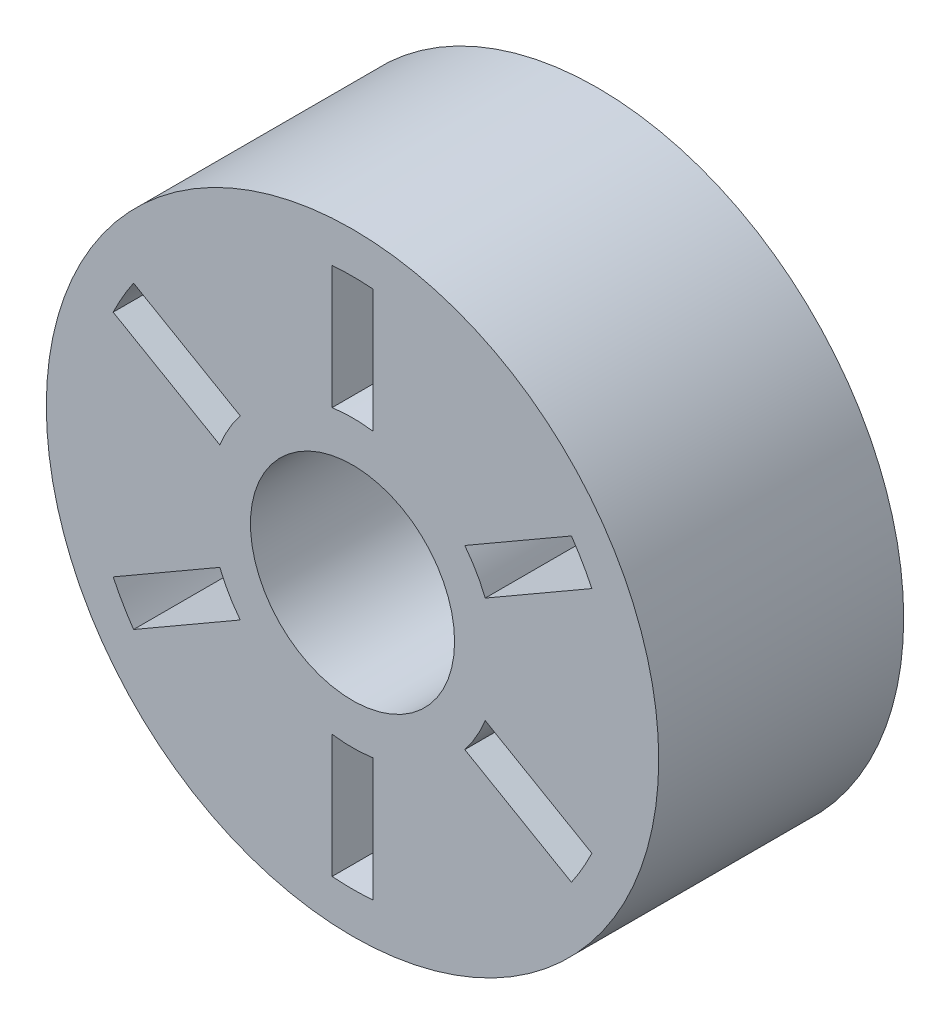
ISO-10303-21;
HEADER;
FILE_DESCRIPTION(('STEP AP214'),'2;1');
FILE_NAME('part.step','',(''),(''),'','','');
FILE_SCHEMA(('AUTOMOTIVE_DESIGN { 1 0 10303 214 1 1 1 1 }'));
ENDSEC;
DATA;
#1=APPLICATION_CONTEXT('core data for automotive mechanical design processes');
#2=APPLICATION_PROTOCOL_DEFINITION('international standard','automotive_design',2000,#1);
#3=PRODUCT_CONTEXT('',#1,'mechanical');
#4=PRODUCT('Part','Part','',(#3));
#5=PRODUCT_RELATED_PRODUCT_CATEGORY('part','',(#4));
#6=PRODUCT_DEFINITION_FORMATION('','',#4);
#7=PRODUCT_DEFINITION_CONTEXT('part definition',#1,'design');
#8=PRODUCT_DEFINITION('design','',#6,#7);
#9=PRODUCT_DEFINITION_SHAPE('','',#8);
#10=(LENGTH_UNIT() NAMED_UNIT(*) SI_UNIT(.MILLI.,.METRE.));
#11=(NAMED_UNIT(*) PLANE_ANGLE_UNIT() SI_UNIT($,.RADIAN.));
#12=(NAMED_UNIT(*) SI_UNIT($,.STERADIAN.) SOLID_ANGLE_UNIT());
#13=UNCERTAINTY_MEASURE_WITH_UNIT(LENGTH_MEASURE(1.E-05),#10,'distance_accuracy_value','');
#14=(GEOMETRIC_REPRESENTATION_CONTEXT(3) GLOBAL_UNCERTAINTY_ASSIGNED_CONTEXT((#13)) GLOBAL_UNIT_ASSIGNED_CONTEXT((#10,
#11,#12)) REPRESENTATION_CONTEXT('',''));
#15=CARTESIAN_POINT('',(0.,0.,0.));
#16=DIRECTION('',(0.,0.,1.));
#17=DIRECTION('',(1.,0.,0.));
#18=AXIS2_PLACEMENT_3D('',#15,#16,#17);
#19=CARTESIAN_POINT('',(0.,0.,30.));
#20=DIRECTION('',(0.,0.,1.));
#21=DIRECTION('',(1.,0.,0.));
#22=AXIS2_PLACEMENT_3D('',#19,#20,#21);
#23=PLANE('',#22);
#24=CARTESIAN_POINT('',(0.,0.,30.));
#25=DIRECTION('',(0.,0.,1.));
#26=DIRECTION('',(0.50000000000001,0.866025403784433,0.));
#27=AXIS2_PLACEMENT_3D('',#24,#25,#26);
#28=CIRCLE('',#27,32.5);
#29=CARTESIAN_POINT('',(-26.8124304008044,18.3669152554811,30.));
#30=VERTEX_POINT('',#29);
#31=CARTESIAN_POINT('',(-29.3124304008044,14.0367882365589,30.));
#32=VERTEX_POINT('',#31);
#33=EDGE_CURVE('E63',#30,#32,#28,.T.);
#34=ORIENTED_EDGE('',*,*,#33,.F.);
#35=DIRECTION('',(-0.866025403784433,0.50000000000001,0.));
#36=VECTOR('',#35,1.);
#37=CARTESIAN_POINT('',(-26.8124304008044,18.3669152554811,30.));
#38=LINE('',#37,#36);
#39=CARTESIAN_POINT('',(-13.7499999999999,10.8253175473056,30.));
#40=VERTEX_POINT('',#39);
#41=EDGE_CURVE('E357',#40,#30,#38,.T.);
#42=ORIENTED_EDGE('',*,*,#41,.F.);
#43=CARTESIAN_POINT('',(0.,0.,30.));
#44=DIRECTION('',(0.,0.,-1.));
#45=DIRECTION('',(0.50000000000001,0.866025403784433,0.));
#46=AXIS2_PLACEMENT_3D('',#43,#44,#45);
#47=CIRCLE('',#46,17.5);
#48=CARTESIAN_POINT('',(-16.2499999999999,6.49519052838348,30.));
#49=VERTEX_POINT('',#48);
#50=EDGE_CURVE('E376',#49,#40,#47,.T.);
#51=ORIENTED_EDGE('',*,*,#50,.F.);
#52=DIRECTION('',(0.866025403784433,-0.50000000000001,0.));
#53=VECTOR('',#52,1.);
#54=CARTESIAN_POINT('',(-29.3124304008044,14.0367882365589,30.));
#55=LINE('',#54,#53);
#56=EDGE_CURVE('E372',#32,#49,#55,.T.);
#57=ORIENTED_EDGE('',*,*,#56,.F.);
#58=EDGE_LOOP('',(#34,#42,#51,#57));
#59=FACE_BOUND('',#58,.T.);
#60=CARTESIAN_POINT('',(0.,0.,30.));
#61=DIRECTION('',(0.,0.,1.));
#62=DIRECTION('',(-0.499999999999992,0.866025403784443,0.));
#63=AXIS2_PLACEMENT_3D('',#60,#61,#62);
#64=CIRCLE('',#63,32.5);
#65=CARTESIAN_POINT('',(-29.3124304008047,-14.0367882365583,30.));
#66=VERTEX_POINT('',#65);
#67=CARTESIAN_POINT('',(-26.8124304008047,-18.3669152554805,30.));
#68=VERTEX_POINT('',#67);
#69=EDGE_CURVE('E71',#66,#68,#64,.T.);
#70=ORIENTED_EDGE('',*,*,#69,.F.);
#71=DIRECTION('',(-0.866025403784443,-0.499999999999992,0.));
#72=VECTOR('',#71,1.);
#73=CARTESIAN_POINT('',(-29.3124304008047,-14.0367882365583,30.));
#74=LINE('',#73,#72);
#75=CARTESIAN_POINT('',(-16.2500000000001,-6.49519052838314,30.));
#76=VERTEX_POINT('',#75);
#77=EDGE_CURVE('E315',#76,#66,#74,.T.);
#78=ORIENTED_EDGE('',*,*,#77,.F.);
#79=CARTESIAN_POINT('',(0.,0.,30.));
#80=DIRECTION('',(0.,0.,-1.));
#81=DIRECTION('',(-0.499999999999992,0.866025403784443,0.));
#82=AXIS2_PLACEMENT_3D('',#79,#80,#81);
#83=CIRCLE('',#82,17.5);
#84=CARTESIAN_POINT('',(-13.7500000000001,-10.8253175473054,30.));
#85=VERTEX_POINT('',#84);
#86=EDGE_CURVE('E335',#85,#76,#83,.T.);
#87=ORIENTED_EDGE('',*,*,#86,.F.);
#88=DIRECTION('',(0.866025403784443,0.499999999999992,0.));
#89=VECTOR('',#88,1.);
#90=CARTESIAN_POINT('',(-26.8124304008047,-18.3669152554805,30.));
#91=LINE('',#90,#89);
#92=EDGE_CURVE('E330',#68,#85,#91,.T.);
#93=ORIENTED_EDGE('',*,*,#92,.F.);
#94=EDGE_LOOP('',(#70,#78,#87,#93));
#95=FACE_BOUND('',#94,.T.);
#96=CARTESIAN_POINT('',(0.,0.,30.));
#97=DIRECTION('',(0.,0.,1.));
#98=DIRECTION('',(-1.,0.,0.));
#99=AXIS2_PLACEMENT_3D('',#96,#97,#98);
#100=CIRCLE('',#99,32.5);
#101=CARTESIAN_POINT('',(-2.5,-32.4037034920393,30.));
#102=VERTEX_POINT('',#101);
#103=CARTESIAN_POINT('',(2.5,-32.4037034920393,30.));
#104=VERTEX_POINT('',#103);
#105=EDGE_CURVE('E284',#102,#104,#100,.T.);
#106=ORIENTED_EDGE('',*,*,#105,.F.);
#107=DIRECTION('',(0.,-1.,0.));
#108=VECTOR('',#107,1.);
#109=CARTESIAN_POINT('',(-2.5,-32.4037034920393,30.));
#110=LINE('',#109,#108);
#111=CARTESIAN_POINT('',(-2.5,-17.3205080756888,30.));
#112=VERTEX_POINT('',#111);
#113=EDGE_CURVE('E271',#112,#102,#110,.T.);
#114=ORIENTED_EDGE('',*,*,#113,.F.);
#115=CARTESIAN_POINT('',(0.,0.,30.));
#116=DIRECTION('',(0.,0.,-1.));
#117=DIRECTION('',(-1.,0.,0.));
#118=AXIS2_PLACEMENT_3D('',#115,#116,#117);
#119=CIRCLE('',#118,17.5);
#120=CARTESIAN_POINT('',(2.5,-17.3205080756888,30.));
#121=VERTEX_POINT('',#120);
#122=EDGE_CURVE('E292',#121,#112,#119,.T.);
#123=ORIENTED_EDGE('',*,*,#122,.F.);
#124=DIRECTION('',(0.,1.,0.));
#125=VECTOR('',#124,1.);
#126=CARTESIAN_POINT('',(2.5,-32.4037034920393,30.));
#127=LINE('',#126,#125);
#128=EDGE_CURVE('E287',#104,#121,#127,.T.);
#129=ORIENTED_EDGE('',*,*,#128,.F.);
#130=EDGE_LOOP('',(#106,#114,#123,#129));
#131=FACE_BOUND('',#130,.T.);
#132=CARTESIAN_POINT('',(0.,0.,30.));
#133=DIRECTION('',(0.,0.,1.));
#134=DIRECTION('',(-0.500000000000004,-0.866025403784436,0.));
#135=AXIS2_PLACEMENT_3D('',#132,#133,#134);
#136=CIRCLE('',#135,32.5);
#137=CARTESIAN_POINT('',(26.8124304008045,-18.3669152554809,30.));
#138=VERTEX_POINT('',#137);
#139=CARTESIAN_POINT('',(29.3124304008045,-14.0367882365587,30.));
#140=VERTEX_POINT('',#139);
#141=EDGE_CURVE('E216',#138,#140,#136,.T.);
#142=ORIENTED_EDGE('',*,*,#141,.F.);
#143=DIRECTION('',(0.866025403784436,-0.500000000000004,0.));
#144=VECTOR('',#143,1.);
#145=CARTESIAN_POINT('',(26.8124304008045,-18.3669152554809,30.));
#146=LINE('',#145,#144);
#147=CARTESIAN_POINT('',(13.75,-10.8253175473056,30.));
#148=VERTEX_POINT('',#147);
#149=EDGE_CURVE('E237',#148,#138,#146,.T.);
#150=ORIENTED_EDGE('',*,*,#149,.F.);
#151=CARTESIAN_POINT('',(0.,0.,30.));
#152=DIRECTION('',(0.,0.,-1.));
#153=DIRECTION('',(-0.500000000000004,-0.866025403784436,0.));
#154=AXIS2_PLACEMENT_3D('',#151,#152,#153);
#155=CIRCLE('',#154,17.5);
#156=CARTESIAN_POINT('',(16.25,-6.49519052838336,30.));
#157=VERTEX_POINT('',#156);
#158=EDGE_CURVE('E241',#157,#148,#155,.T.);
#159=ORIENTED_EDGE('',*,*,#158,.F.);
#160=DIRECTION('',(-0.866025403784436,0.500000000000004,0.));
#161=VECTOR('',#160,1.);
#162=CARTESIAN_POINT('',(29.3124304008045,-14.0367882365587,30.));
#163=LINE('',#162,#161);
#164=EDGE_CURVE('E250',#140,#157,#163,.T.);
#165=ORIENTED_EDGE('',*,*,#164,.F.);
#166=EDGE_LOOP('',(#142,#150,#159,#165));
#167=FACE_BOUND('',#166,.T.);
#168=CARTESIAN_POINT('',(0.,0.,30.));
#169=DIRECTION('',(0.,0.,1.));
#170=DIRECTION('',(0.499999999999998,-0.86602540378444,0.));
#171=AXIS2_PLACEMENT_3D('',#168,#169,#170);
#172=CIRCLE('',#171,32.5);
#173=CARTESIAN_POINT('',(29.3124304008046,14.0367882365585,30.));
#174=VERTEX_POINT('',#173);
#175=CARTESIAN_POINT('',(26.8124304008046,18.3669152554807,30.));
#176=VERTEX_POINT('',#175);
#177=EDGE_CURVE('E260',#174,#176,#172,.T.);
#178=ORIENTED_EDGE('',*,*,#177,.F.);
#179=DIRECTION('',(0.86602540378444,0.499999999999998,0.));
#180=VECTOR('',#179,1.);
#181=CARTESIAN_POINT('',(29.3124304008046,14.0367882365585,30.));
#182=LINE('',#181,#180);
#183=CARTESIAN_POINT('',(16.25,6.49519052838325,30.));
#184=VERTEX_POINT('',#183);
#185=EDGE_CURVE('E398',#184,#174,#182,.T.);
#186=ORIENTED_EDGE('',*,*,#185,.F.);
#187=CARTESIAN_POINT('',(0.,0.,30.));
#188=DIRECTION('',(0.,0.,-1.));
#189=DIRECTION('',(0.499999999999998,-0.86602540378444,0.));
#190=AXIS2_PLACEMENT_3D('',#187,#188,#189);
#191=CIRCLE('',#190,17.5);
#192=CARTESIAN_POINT('',(13.75,10.8253175473055,30.));
#193=VERTEX_POINT('',#192);
#194=EDGE_CURVE('E417',#193,#184,#191,.T.);
#195=ORIENTED_EDGE('',*,*,#194,.F.);
#196=DIRECTION('',(-0.86602540378444,-0.499999999999998,0.));
#197=VECTOR('',#196,1.);
#198=CARTESIAN_POINT('',(26.8124304008046,18.3669152554807,30.));
#199=LINE('',#198,#197);
#200=EDGE_CURVE('E413',#176,#193,#199,.T.);
#201=ORIENTED_EDGE('',*,*,#200,.F.);
#202=EDGE_LOOP('',(#178,#186,#195,#201));
#203=FACE_BOUND('',#202,.T.);
#204=CARTESIAN_POINT('',(0.,0.,30.));
#205=DIRECTION('',(0.,0.,1.));
#206=DIRECTION('',(1.,0.,0.));
#207=AXIS2_PLACEMENT_3D('',#204,#205,#206);
#208=CIRCLE('',#207,32.5);
#209=CARTESIAN_POINT('',(2.5,32.4037034920393,30.));
#210=VERTEX_POINT('',#209);
#211=CARTESIAN_POINT('',(-2.5,32.4037034920393,30.));
#212=VERTEX_POINT('',#211);
#213=EDGE_CURVE('E427',#210,#212,#208,.T.);
#214=ORIENTED_EDGE('',*,*,#213,.F.);
#215=DIRECTION('',(0.,1.,0.));
#216=VECTOR('',#215,1.);
#217=CARTESIAN_POINT('',(2.5,32.4037034920393,30.));
#218=LINE('',#217,#216);
#219=CARTESIAN_POINT('',(2.5,17.3205080756888,30.));
#220=VERTEX_POINT('',#219);
#221=EDGE_CURVE('E442',#220,#210,#218,.T.);
#222=ORIENTED_EDGE('',*,*,#221,.F.);
#223=CARTESIAN_POINT('',(0.,0.,30.));
#224=DIRECTION('',(0.,0.,-1.));
#225=DIRECTION('',(1.,0.,0.));
#226=AXIS2_PLACEMENT_3D('',#223,#224,#225);
#227=CIRCLE('',#226,17.5);
#228=CARTESIAN_POINT('',(-2.5,17.3205080756888,30.));
#229=VERTEX_POINT('',#228);
#230=EDGE_CURVE('E461',#229,#220,#227,.T.);
#231=ORIENTED_EDGE('',*,*,#230,.F.);
#232=DIRECTION('',(0.,-1.,0.));
#233=VECTOR('',#232,1.);
#234=CARTESIAN_POINT('',(-2.5,32.4037034920393,30.));
#235=LINE('',#234,#233);
#236=EDGE_CURVE('E457',#212,#229,#235,.T.);
#237=ORIENTED_EDGE('',*,*,#236,.F.);
#238=EDGE_LOOP('',(#214,#222,#231,#237));
#239=FACE_BOUND('',#238,.T.);
#240=CARTESIAN_POINT('',(0.,0.,30.));
#241=DIRECTION('',(0.,0.,1.));
#242=DIRECTION('',(1.,0.,0.));
#243=AXIS2_PLACEMENT_3D('',#240,#241,#242);
#244=CIRCLE('',#243,37.5);
#245=CARTESIAN_POINT('',(37.5,0.,30.));
#246=VERTEX_POINT('',#245);
#247=EDGE_CURVE('E11',#246,#246,#244,.T.);
#248=ORIENTED_EDGE('',*,*,#247,.T.);
#249=EDGE_LOOP('',(#248));
#250=FACE_BOUND('',#249,.T.);
#251=CARTESIAN_POINT('',(0.,0.,30.));
#252=DIRECTION('',(0.,0.,1.));
#253=DIRECTION('',(1.,0.,0.));
#254=AXIS2_PLACEMENT_3D('',#251,#252,#253);
#255=CIRCLE('',#254,12.5);
#256=CARTESIAN_POINT('',(12.5,0.,30.));
#257=VERTEX_POINT('',#256);
#258=EDGE_CURVE('E481',#257,#257,#255,.T.);
#259=ORIENTED_EDGE('',*,*,#258,.F.);
#260=EDGE_LOOP('',(#259));
#261=FACE_BOUND('',#260,.T.);
#262=ADVANCED_FACE('F47',(#59,#95,#131,#167,#203,#239,#250,#261),#23,.T.);
#263=CARTESIAN_POINT('',(0.,0.,0.));
#264=DIRECTION('',(0.,0.,1.));
#265=DIRECTION('',(1.,0.,0.));
#266=AXIS2_PLACEMENT_3D('',#263,#264,#265);
#267=PLANE('',#266);
#268=DIRECTION('',(-0.866025403784433,0.50000000000001,0.));
#269=VECTOR('',#268,1.);
#270=CARTESIAN_POINT('',(-26.8124304008044,18.3669152554811,0.));
#271=LINE('',#270,#269);
#272=CARTESIAN_POINT('',(-13.7499999999999,10.8253175473056,0.));
#273=VERTEX_POINT('',#272);
#274=CARTESIAN_POINT('',(-26.8124304008044,18.3669152554811,0.));
#275=VERTEX_POINT('',#274);
#276=EDGE_CURVE('E365',#273,#275,#271,.T.);
#277=ORIENTED_EDGE('',*,*,#276,.T.);
#278=CARTESIAN_POINT('',(0.,0.,0.));
#279=DIRECTION('',(0.,0.,1.));
#280=DIRECTION('',(0.50000000000001,0.866025403784433,0.));
#281=AXIS2_PLACEMENT_3D('',#278,#279,#280);
#282=CIRCLE('',#281,32.5);
#283=CARTESIAN_POINT('',(-29.3124304008044,14.0367882365589,0.));
#284=VERTEX_POINT('',#283);
#285=EDGE_CURVE('E352',#275,#284,#282,.T.);
#286=ORIENTED_EDGE('',*,*,#285,.T.);
#287=DIRECTION('',(0.866025403784433,-0.50000000000001,0.));
#288=VECTOR('',#287,1.);
#289=CARTESIAN_POINT('',(-29.3124304008044,14.0367882365589,0.));
#290=LINE('',#289,#288);
#291=CARTESIAN_POINT('',(-16.2499999999999,6.49519052838348,0.));
#292=VERTEX_POINT('',#291);
#293=EDGE_CURVE('E356',#284,#292,#290,.T.);
#294=ORIENTED_EDGE('',*,*,#293,.T.);
#295=CARTESIAN_POINT('',(0.,0.,0.));
#296=DIRECTION('',(0.,0.,-1.));
#297=DIRECTION('',(0.50000000000001,0.866025403784433,0.));
#298=AXIS2_PLACEMENT_3D('',#295,#296,#297);
#299=CIRCLE('',#298,17.5);
#300=EDGE_CURVE('E361',#292,#273,#299,.T.);
#301=ORIENTED_EDGE('',*,*,#300,.T.);
#302=EDGE_LOOP('',(#277,#286,#294,#301));
#303=FACE_BOUND('',#302,.T.);
#304=DIRECTION('',(-0.866025403784443,-0.499999999999992,0.));
#305=VECTOR('',#304,1.);
#306=CARTESIAN_POINT('',(-29.3124304008047,-14.0367882365583,0.));
#307=LINE('',#306,#305);
#308=CARTESIAN_POINT('',(-16.2500000000001,-6.49519052838314,0.));
#309=VERTEX_POINT('',#308);
#310=CARTESIAN_POINT('',(-29.3124304008047,-14.0367882365583,0.));
#311=VERTEX_POINT('',#310);
#312=EDGE_CURVE('E323',#309,#311,#307,.T.);
#313=ORIENTED_EDGE('',*,*,#312,.T.);
#314=CARTESIAN_POINT('',(0.,0.,0.));
#315=DIRECTION('',(0.,0.,1.));
#316=DIRECTION('',(-0.499999999999992,0.866025403784443,0.));
#317=AXIS2_PLACEMENT_3D('',#314,#315,#316);
#318=CIRCLE('',#317,32.5);
#319=CARTESIAN_POINT('',(-26.8124304008047,-18.3669152554805,0.));
#320=VERTEX_POINT('',#319);
#321=EDGE_CURVE('E310',#311,#320,#318,.T.);
#322=ORIENTED_EDGE('',*,*,#321,.T.);
#323=DIRECTION('',(0.866025403784443,0.499999999999992,0.));
#324=VECTOR('',#323,1.);
#325=CARTESIAN_POINT('',(-26.8124304008047,-18.3669152554805,0.));
#326=LINE('',#325,#324);
#327=CARTESIAN_POINT('',(-13.7500000000001,-10.8253175473054,0.));
#328=VERTEX_POINT('',#327);
#329=EDGE_CURVE('E314',#320,#328,#326,.T.);
#330=ORIENTED_EDGE('',*,*,#329,.T.);
#331=CARTESIAN_POINT('',(0.,0.,0.));
#332=DIRECTION('',(0.,0.,-1.));
#333=DIRECTION('',(-0.499999999999992,0.866025403784443,0.));
#334=AXIS2_PLACEMENT_3D('',#331,#332,#333);
#335=CIRCLE('',#334,17.5);
#336=EDGE_CURVE('E319',#328,#309,#335,.T.);
#337=ORIENTED_EDGE('',*,*,#336,.T.);
#338=EDGE_LOOP('',(#313,#322,#330,#337));
#339=FACE_BOUND('',#338,.T.);
#340=DIRECTION('',(0.,-1.,0.));
#341=VECTOR('',#340,1.);
#342=CARTESIAN_POINT('',(-2.5,-32.4037034920393,0.));
#343=LINE('',#342,#341);
#344=CARTESIAN_POINT('',(-2.5,-17.3205080756888,0.));
#345=VERTEX_POINT('',#344);
#346=CARTESIAN_POINT('',(-2.5,-32.4037034920393,0.));
#347=VERTEX_POINT('',#346);
#348=EDGE_CURVE('E279',#345,#347,#343,.T.);
#349=ORIENTED_EDGE('',*,*,#348,.T.);
#350=CARTESIAN_POINT('',(0.,0.,0.));
#351=DIRECTION('',(0.,0.,1.));
#352=DIRECTION('',(-1.,0.,0.));
#353=AXIS2_PLACEMENT_3D('',#350,#351,#352);
#354=CIRCLE('',#353,32.5);
#355=CARTESIAN_POINT('',(2.5,-32.4037034920393,0.));
#356=VERTEX_POINT('',#355);
#357=EDGE_CURVE('E266',#347,#356,#354,.T.);
#358=ORIENTED_EDGE('',*,*,#357,.T.);
#359=DIRECTION('',(0.,1.,0.));
#360=VECTOR('',#359,1.);
#361=CARTESIAN_POINT('',(2.5,-32.4037034920393,0.));
#362=LINE('',#361,#360);
#363=CARTESIAN_POINT('',(2.5,-17.3205080756888,0.));
#364=VERTEX_POINT('',#363);
#365=EDGE_CURVE('E270',#356,#364,#362,.T.);
#366=ORIENTED_EDGE('',*,*,#365,.T.);
#367=CARTESIAN_POINT('',(0.,0.,0.));
#368=DIRECTION('',(0.,0.,-1.));
#369=DIRECTION('',(-1.,0.,0.));
#370=AXIS2_PLACEMENT_3D('',#367,#368,#369);
#371=CIRCLE('',#370,17.5);
#372=EDGE_CURVE('E275',#364,#345,#371,.T.);
#373=ORIENTED_EDGE('',*,*,#372,.T.);
#374=EDGE_LOOP('',(#349,#358,#366,#373));
#375=FACE_BOUND('',#374,.T.);
#376=DIRECTION('',(0.866025403784436,-0.500000000000004,0.));
#377=VECTOR('',#376,1.);
#378=CARTESIAN_POINT('',(26.8124304008045,-18.3669152554809,0.));
#379=LINE('',#378,#377);
#380=CARTESIAN_POINT('',(13.75,-10.8253175473056,0.));
#381=VERTEX_POINT('',#380);
#382=CARTESIAN_POINT('',(26.8124304008045,-18.3669152554809,0.));
#383=VERTEX_POINT('',#382);
#384=EDGE_CURVE('E222',#381,#383,#379,.T.);
#385=ORIENTED_EDGE('',*,*,#384,.T.);
#386=CARTESIAN_POINT('',(0.,0.,0.));
#387=DIRECTION('',(0.,0.,1.));
#388=DIRECTION('',(-0.500000000000004,-0.866025403784436,0.));
#389=AXIS2_PLACEMENT_3D('',#386,#387,#388);
#390=CIRCLE('',#389,32.5);
#391=CARTESIAN_POINT('',(29.3124304008045,-14.0367882365587,0.));
#392=VERTEX_POINT('',#391);
#393=EDGE_CURVE('E213',#383,#392,#390,.T.);
#394=ORIENTED_EDGE('',*,*,#393,.T.);
#395=DIRECTION('',(-0.866025403784436,0.500000000000004,0.));
#396=VECTOR('',#395,1.);
#397=CARTESIAN_POINT('',(29.3124304008045,-14.0367882365587,0.));
#398=LINE('',#397,#396);
#399=CARTESIAN_POINT('',(16.25,-6.49519052838337,0.));
#400=VERTEX_POINT('',#399);
#401=EDGE_CURVE('E226',#392,#400,#398,.T.);
#402=ORIENTED_EDGE('',*,*,#401,.T.);
#403=CARTESIAN_POINT('',(0.,0.,0.));
#404=DIRECTION('',(0.,0.,-1.));
#405=DIRECTION('',(-0.500000000000004,-0.866025403784436,0.));
#406=AXIS2_PLACEMENT_3D('',#403,#404,#405);
#407=CIRCLE('',#406,17.5);
#408=EDGE_CURVE('E231',#400,#381,#407,.T.);
#409=ORIENTED_EDGE('',*,*,#408,.T.);
#410=EDGE_LOOP('',(#385,#394,#402,#409));
#411=FACE_BOUND('',#410,.T.);
#412=DIRECTION('',(0.86602540378444,0.499999999999998,0.));
#413=VECTOR('',#412,1.);
#414=CARTESIAN_POINT('',(29.3124304008046,14.0367882365585,0.));
#415=LINE('',#414,#413);
#416=CARTESIAN_POINT('',(16.25,6.49519052838325,0.));
#417=VERTEX_POINT('',#416);
#418=CARTESIAN_POINT('',(29.3124304008046,14.0367882365585,0.));
#419=VERTEX_POINT('',#418);
#420=EDGE_CURVE('E406',#417,#419,#415,.T.);
#421=ORIENTED_EDGE('',*,*,#420,.T.);
#422=CARTESIAN_POINT('',(0.,0.,0.));
#423=DIRECTION('',(0.,0.,1.));
#424=DIRECTION('',(0.499999999999998,-0.86602540378444,0.));
#425=AXIS2_PLACEMENT_3D('',#422,#423,#424);
#426=CIRCLE('',#425,32.5);
#427=CARTESIAN_POINT('',(26.8124304008046,18.3669152554807,0.));
#428=VERTEX_POINT('',#427);
#429=EDGE_CURVE('E393',#419,#428,#426,.T.);
#430=ORIENTED_EDGE('',*,*,#429,.T.);
#431=DIRECTION('',(-0.86602540378444,-0.499999999999998,0.));
#432=VECTOR('',#431,1.);
#433=CARTESIAN_POINT('',(26.8124304008046,18.3669152554807,0.));
#434=LINE('',#433,#432);
#435=CARTESIAN_POINT('',(13.75,10.8253175473055,0.));
#436=VERTEX_POINT('',#435);
#437=EDGE_CURVE('E397',#428,#436,#434,.T.);
#438=ORIENTED_EDGE('',*,*,#437,.T.);
#439=CARTESIAN_POINT('',(0.,0.,0.));
#440=DIRECTION('',(0.,0.,-1.));
#441=DIRECTION('',(0.499999999999998,-0.86602540378444,0.));
#442=AXIS2_PLACEMENT_3D('',#439,#440,#441);
#443=CIRCLE('',#442,17.5);
#444=EDGE_CURVE('E402',#436,#417,#443,.T.);
#445=ORIENTED_EDGE('',*,*,#444,.T.);
#446=EDGE_LOOP('',(#421,#430,#438,#445));
#447=FACE_BOUND('',#446,.T.);
#448=DIRECTION('',(0.,1.,0.));
#449=VECTOR('',#448,1.);
#450=CARTESIAN_POINT('',(2.5,32.4037034920393,0.));
#451=LINE('',#450,#449);
#452=CARTESIAN_POINT('',(2.5,17.3205080756888,0.));
#453=VERTEX_POINT('',#452);
#454=CARTESIAN_POINT('',(2.5,32.4037034920393,0.));
#455=VERTEX_POINT('',#454);
#456=EDGE_CURVE('E450',#453,#455,#451,.T.);
#457=ORIENTED_EDGE('',*,*,#456,.T.);
#458=CARTESIAN_POINT('',(0.,0.,0.));
#459=DIRECTION('',(0.,0.,1.));
#460=DIRECTION('',(1.,0.,0.));
#461=AXIS2_PLACEMENT_3D('',#458,#459,#460);
#462=CIRCLE('',#461,32.5);
#463=CARTESIAN_POINT('',(-2.5,32.4037034920393,0.));
#464=VERTEX_POINT('',#463);
#465=EDGE_CURVE('E437',#455,#464,#462,.T.);
#466=ORIENTED_EDGE('',*,*,#465,.T.);
#467=DIRECTION('',(0.,-1.,0.));
#468=VECTOR('',#467,1.);
#469=CARTESIAN_POINT('',(-2.5,32.4037034920393,0.));
#470=LINE('',#469,#468);
#471=CARTESIAN_POINT('',(-2.5,17.3205080756888,0.));
#472=VERTEX_POINT('',#471);
#473=EDGE_CURVE('E441',#464,#472,#470,.T.);
#474=ORIENTED_EDGE('',*,*,#473,.T.);
#475=CARTESIAN_POINT('',(0.,0.,0.));
#476=DIRECTION('',(0.,0.,-1.));
#477=DIRECTION('',(1.,0.,0.));
#478=AXIS2_PLACEMENT_3D('',#475,#476,#477);
#479=CIRCLE('',#478,17.5);
#480=EDGE_CURVE('E446',#472,#453,#479,.T.);
#481=ORIENTED_EDGE('',*,*,#480,.T.);
#482=EDGE_LOOP('',(#457,#466,#474,#481));
#483=FACE_BOUND('',#482,.T.);
#484=CARTESIAN_POINT('',(0.,0.,0.));
#485=DIRECTION('',(0.,0.,1.));
#486=DIRECTION('',(1.,0.,0.));
#487=AXIS2_PLACEMENT_3D('',#484,#485,#486);
#488=CIRCLE('',#487,37.5);
#489=CARTESIAN_POINT('',(37.5,0.,0.));
#490=VERTEX_POINT('',#489);
#491=EDGE_CURVE('E51',#490,#490,#488,.T.);
#492=ORIENTED_EDGE('',*,*,#491,.F.);
#493=EDGE_LOOP('',(#492));
#494=FACE_BOUND('',#493,.T.);
#495=CARTESIAN_POINT('',(0.,0.,0.));
#496=DIRECTION('',(0.,0.,1.));
#497=DIRECTION('',(1.,0.,0.));
#498=AXIS2_PLACEMENT_3D('',#495,#496,#497);
#499=CIRCLE('',#498,12.5);
#500=CARTESIAN_POINT('',(12.5,0.,0.));
#501=VERTEX_POINT('',#500);
#502=EDGE_CURVE('E471',#501,#501,#499,.T.);
#503=ORIENTED_EDGE('',*,*,#502,.T.);
#504=EDGE_LOOP('',(#503));
#505=FACE_BOUND('',#504,.T.);
#506=ADVANCED_FACE('F233',(#303,#339,#375,#411,#447,#483,#494,#505),#267,.F.);
#507=CARTESIAN_POINT('',(0.,0.,30.));
#508=DIRECTION('',(0.,0.,-1.));
#509=DIRECTION('',(-1.,0.,0.));
#510=AXIS2_PLACEMENT_3D('',#507,#508,#509);
#511=CYLINDRICAL_SURFACE('',#510,37.5);
#512=ORIENTED_EDGE('',*,*,#247,.F.);
#513=EDGE_LOOP('',(#512));
#514=FACE_BOUND('',#513,.T.);
#515=ORIENTED_EDGE('',*,*,#491,.T.);
#516=EDGE_LOOP('',(#515));
#517=FACE_BOUND('',#516,.T.);
#518=ADVANCED_FACE('F49',(#514,#517),#511,.T.);
#519=CARTESIAN_POINT('',(0.,0.,30.));
#520=DIRECTION('',(0.,0.,-1.));
#521=DIRECTION('',(-1.,0.,0.));
#522=AXIS2_PLACEMENT_3D('',#519,#520,#521);
#523=CYLINDRICAL_SURFACE('',#522,12.5);
#524=ORIENTED_EDGE('',*,*,#258,.T.);
#525=EDGE_LOOP('',(#524));
#526=FACE_BOUND('',#525,.T.);
#527=ORIENTED_EDGE('',*,*,#502,.F.);
#528=EDGE_LOOP('',(#527));
#529=FACE_BOUND('',#528,.T.);
#530=ADVANCED_FACE('F490',(#526,#529),#523,.F.);
#531=CARTESIAN_POINT('',(0.,0.,0.));
#532=DIRECTION('',(0.,0.,1.));
#533=DIRECTION('',(1.,0.,0.));
#534=AXIS2_PLACEMENT_3D('',#531,#532,#533);
#535=CYLINDRICAL_SURFACE('',#534,32.5);
#536=ORIENTED_EDGE('',*,*,#213,.T.);
#537=DIRECTION('',(0.,0.,1.));
#538=VECTOR('',#537,1.);
#539=CARTESIAN_POINT('',(-2.5,32.4037034920393,0.));
#540=LINE('',#539,#538);
#541=EDGE_CURVE('E454',#464,#212,#540,.T.);
#542=ORIENTED_EDGE('',*,*,#541,.F.);
#543=ORIENTED_EDGE('',*,*,#465,.F.);
#544=DIRECTION('',(0.,0.,1.));
#545=VECTOR('',#544,1.);
#546=CARTESIAN_POINT('',(2.5,32.4037034920393,0.));
#547=LINE('',#546,#545);
#548=EDGE_CURVE('E468',#455,#210,#547,.T.);
#549=ORIENTED_EDGE('',*,*,#548,.T.);
#550=EDGE_LOOP('',(#536,#542,#543,#549));
#551=FACE_BOUND('',#550,.T.);
#552=ADVANCED_FACE('F492',(#551),#535,.F.);
#553=CARTESIAN_POINT('',(2.5,32.4037034920393,0.));
#554=DIRECTION('',(1.,0.,0.));
#555=DIRECTION('',(0.,1.,0.));
#556=AXIS2_PLACEMENT_3D('',#553,#554,#555);
#557=PLANE('',#556);
#558=ORIENTED_EDGE('',*,*,#221,.T.);
#559=ORIENTED_EDGE('',*,*,#548,.F.);
#560=ORIENTED_EDGE('',*,*,#456,.F.);
#561=DIRECTION('',(0.,0.,1.));
#562=VECTOR('',#561,1.);
#563=CARTESIAN_POINT('',(2.5,17.3205080756888,0.));
#564=LINE('',#563,#562);
#565=EDGE_CURVE('E472',#453,#220,#564,.T.);
#566=ORIENTED_EDGE('',*,*,#565,.T.);
#567=EDGE_LOOP('',(#558,#559,#560,#566));
#568=FACE_BOUND('',#567,.T.);
#569=ADVANCED_FACE('F499',(#568),#557,.F.);
#570=CARTESIAN_POINT('',(0.,0.,0.));
#571=DIRECTION('',(0.,0.,1.));
#572=DIRECTION('',(1.,0.,0.));
#573=AXIS2_PLACEMENT_3D('',#570,#571,#572);
#574=CYLINDRICAL_SURFACE('',#573,17.5);
#575=ORIENTED_EDGE('',*,*,#230,.T.);
#576=ORIENTED_EDGE('',*,*,#565,.F.);
#577=ORIENTED_EDGE('',*,*,#480,.F.);
#578=DIRECTION('',(0.,0.,1.));
#579=VECTOR('',#578,1.);
#580=CARTESIAN_POINT('',(-2.5,17.3205080756888,0.));
#581=LINE('',#580,#579);
#582=EDGE_CURVE('E475',#472,#229,#581,.T.);
#583=ORIENTED_EDGE('',*,*,#582,.T.);
#584=EDGE_LOOP('',(#575,#576,#577,#583));
#585=FACE_BOUND('',#584,.T.);
#586=ADVANCED_FACE('F549',(#585),#574,.T.);
#587=CARTESIAN_POINT('',(-2.5,32.4037034920393,0.));
#588=DIRECTION('',(-1.,0.,0.));
#589=DIRECTION('',(0.,-1.,0.));
#590=AXIS2_PLACEMENT_3D('',#587,#588,#589);
#591=PLANE('',#590);
#592=ORIENTED_EDGE('',*,*,#236,.T.);
#593=ORIENTED_EDGE('',*,*,#582,.F.);
#594=ORIENTED_EDGE('',*,*,#473,.F.);
#595=ORIENTED_EDGE('',*,*,#541,.T.);
#596=EDGE_LOOP('',(#592,#593,#594,#595));
#597=FACE_BOUND('',#596,.T.);
#598=ADVANCED_FACE('F543',(#597),#591,.F.);
#599=CARTESIAN_POINT('',(0.,0.,0.));
#600=DIRECTION('',(0.,0.,1.));
#601=DIRECTION('',(1.,0.,0.));
#602=AXIS2_PLACEMENT_3D('',#599,#600,#601);
#603=CYLINDRICAL_SURFACE('',#602,32.5);
#604=ORIENTED_EDGE('',*,*,#177,.T.);
#605=DIRECTION('',(0.,0.,1.));
#606=VECTOR('',#605,1.);
#607=CARTESIAN_POINT('',(26.8124304008046,18.3669152554807,0.));
#608=LINE('',#607,#606);
#609=EDGE_CURVE('E410',#428,#176,#608,.T.);
#610=ORIENTED_EDGE('',*,*,#609,.F.);
#611=ORIENTED_EDGE('',*,*,#429,.F.);
#612=DIRECTION('',(0.,0.,1.));
#613=VECTOR('',#612,1.);
#614=CARTESIAN_POINT('',(29.3124304008046,14.0367882365585,0.));
#615=LINE('',#614,#613);
#616=EDGE_CURVE('E424',#419,#174,#615,.T.);
#617=ORIENTED_EDGE('',*,*,#616,.T.);
#618=EDGE_LOOP('',(#604,#610,#611,#617));
#619=FACE_BOUND('',#618,.T.);
#620=ADVANCED_FACE('F555',(#619),#603,.F.);
#621=CARTESIAN_POINT('',(29.3124304008046,14.0367882365585,0.));
#622=DIRECTION('',(0.499999999999998,-0.86602540378444,0.));
#623=DIRECTION('',(0.86602540378444,0.499999999999998,0.));
#624=AXIS2_PLACEMENT_3D('',#621,#622,#623);
#625=PLANE('',#624);
#626=ORIENTED_EDGE('',*,*,#185,.T.);
#627=ORIENTED_EDGE('',*,*,#616,.F.);
#628=ORIENTED_EDGE('',*,*,#420,.F.);
#629=DIRECTION('',(0.,0.,1.));
#630=VECTOR('',#629,1.);
#631=CARTESIAN_POINT('',(16.25,6.49519052838325,0.));
#632=LINE('',#631,#630);
#633=EDGE_CURVE('E428',#417,#184,#632,.T.);
#634=ORIENTED_EDGE('',*,*,#633,.T.);
#635=EDGE_LOOP('',(#626,#627,#628,#634));
#636=FACE_BOUND('',#635,.T.);
#637=ADVANCED_FACE('F561',(#636),#625,.F.);
#638=CARTESIAN_POINT('',(0.,0.,0.));
#639=DIRECTION('',(0.,0.,1.));
#640=DIRECTION('',(1.,0.,0.));
#641=AXIS2_PLACEMENT_3D('',#638,#639,#640);
#642=CYLINDRICAL_SURFACE('',#641,17.5);
#643=ORIENTED_EDGE('',*,*,#194,.T.);
#644=ORIENTED_EDGE('',*,*,#633,.F.);
#645=ORIENTED_EDGE('',*,*,#444,.F.);
#646=DIRECTION('',(0.,0.,1.));
#647=VECTOR('',#646,1.);
#648=CARTESIAN_POINT('',(13.75,10.8253175473055,0.));
#649=LINE('',#648,#647);
#650=EDGE_CURVE('E431',#436,#193,#649,.T.);
#651=ORIENTED_EDGE('',*,*,#650,.T.);
#652=EDGE_LOOP('',(#643,#644,#645,#651));
#653=FACE_BOUND('',#652,.T.);
#654=ADVANCED_FACE('F566',(#653),#642,.T.);
#655=CARTESIAN_POINT('',(26.8124304008046,18.3669152554807,0.));
#656=DIRECTION('',(-0.499999999999998,0.86602540378444,0.));
#657=DIRECTION('',(-0.86602540378444,-0.499999999999998,0.));
#658=AXIS2_PLACEMENT_3D('',#655,#656,#657);
#659=PLANE('',#658);
#660=ORIENTED_EDGE('',*,*,#200,.T.);
#661=ORIENTED_EDGE('',*,*,#650,.F.);
#662=ORIENTED_EDGE('',*,*,#437,.F.);
#663=ORIENTED_EDGE('',*,*,#609,.T.);
#664=EDGE_LOOP('',(#660,#661,#662,#663));
#665=FACE_BOUND('',#664,.T.);
#666=ADVANCED_FACE('F563',(#665),#659,.F.);
#667=CARTESIAN_POINT('',(0.,0.,0.));
#668=DIRECTION('',(0.,0.,1.));
#669=DIRECTION('',(1.,0.,0.));
#670=AXIS2_PLACEMENT_3D('',#667,#668,#669);
#671=CYLINDRICAL_SURFACE('',#670,32.5);
#672=ORIENTED_EDGE('',*,*,#141,.T.);
#673=DIRECTION('',(0.,0.,1.));
#674=VECTOR('',#673,1.);
#675=CARTESIAN_POINT('',(29.3124304008045,-14.0367882365587,0.));
#676=LINE('',#675,#674);
#677=EDGE_CURVE('E209',#392,#140,#676,.T.);
#678=ORIENTED_EDGE('',*,*,#677,.F.);
#679=ORIENTED_EDGE('',*,*,#393,.F.);
#680=DIRECTION('',(0.,0.,1.));
#681=VECTOR('',#680,1.);
#682=CARTESIAN_POINT('',(26.8124304008045,-18.3669152554809,0.));
#683=LINE('',#682,#681);
#684=EDGE_CURVE('E257',#383,#138,#683,.T.);
#685=ORIENTED_EDGE('',*,*,#684,.T.);
#686=EDGE_LOOP('',(#672,#678,#679,#685));
#687=FACE_BOUND('',#686,.T.);
#688=ADVANCED_FACE('F211',(#687),#671,.F.);
#689=CARTESIAN_POINT('',(26.8124304008045,-18.3669152554809,0.));
#690=DIRECTION('',(-0.500000000000004,-0.866025403784436,0.));
#691=DIRECTION('',(0.866025403784436,-0.500000000000004,0.));
#692=AXIS2_PLACEMENT_3D('',#689,#690,#691);
#693=PLANE('',#692);
#694=ORIENTED_EDGE('',*,*,#149,.T.);
#695=ORIENTED_EDGE('',*,*,#684,.F.);
#696=ORIENTED_EDGE('',*,*,#384,.F.);
#697=DIRECTION('',(0.,0.,1.));
#698=VECTOR('',#697,1.);
#699=CARTESIAN_POINT('',(13.75,-10.8253175473056,0.));
#700=LINE('',#699,#698);
#701=EDGE_CURVE('E261',#381,#148,#700,.T.);
#702=ORIENTED_EDGE('',*,*,#701,.T.);
#703=EDGE_LOOP('',(#694,#695,#696,#702));
#704=FACE_BOUND('',#703,.T.);
#705=ADVANCED_FACE('F622',(#704),#693,.F.);
#706=CARTESIAN_POINT('',(0.,0.,0.));
#707=DIRECTION('',(0.,0.,1.));
#708=DIRECTION('',(1.,0.,0.));
#709=AXIS2_PLACEMENT_3D('',#706,#707,#708);
#710=CYLINDRICAL_SURFACE('',#709,17.5);
#711=ORIENTED_EDGE('',*,*,#158,.T.);
#712=ORIENTED_EDGE('',*,*,#701,.F.);
#713=ORIENTED_EDGE('',*,*,#408,.F.);
#714=DIRECTION('',(0.,0.,1.));
#715=VECTOR('',#714,1.);
#716=CARTESIAN_POINT('',(16.25,-6.49519052838336,0.));
#717=LINE('',#716,#715);
#718=EDGE_CURVE('E221',#400,#157,#717,.T.);
#719=ORIENTED_EDGE('',*,*,#718,.T.);
#720=EDGE_LOOP('',(#711,#712,#713,#719));
#721=FACE_BOUND('',#720,.T.);
#722=ADVANCED_FACE('F625',(#721),#710,.T.);
#723=CARTESIAN_POINT('',(29.3124304008045,-14.0367882365587,0.));
#724=DIRECTION('',(0.500000000000004,0.866025403784436,0.));
#725=DIRECTION('',(-0.866025403784436,0.500000000000004,0.));
#726=AXIS2_PLACEMENT_3D('',#723,#724,#725);
#727=PLANE('',#726);
#728=ORIENTED_EDGE('',*,*,#164,.T.);
#729=ORIENTED_EDGE('',*,*,#718,.F.);
#730=ORIENTED_EDGE('',*,*,#401,.F.);
#731=ORIENTED_EDGE('',*,*,#677,.T.);
#732=EDGE_LOOP('',(#728,#729,#730,#731));
#733=FACE_BOUND('',#732,.T.);
#734=ADVANCED_FACE('F227',(#733),#727,.F.);
#735=CARTESIAN_POINT('',(0.,0.,0.));
#736=DIRECTION('',(0.,0.,1.));
#737=DIRECTION('',(1.,0.,0.));
#738=AXIS2_PLACEMENT_3D('',#735,#736,#737);
#739=CYLINDRICAL_SURFACE('',#738,32.5);
#740=ORIENTED_EDGE('',*,*,#105,.T.);
#741=DIRECTION('',(0.,0.,1.));
#742=VECTOR('',#741,1.);
#743=CARTESIAN_POINT('',(2.5,-32.4037034920393,0.));
#744=LINE('',#743,#742);
#745=EDGE_CURVE('E283',#356,#104,#744,.T.);
#746=ORIENTED_EDGE('',*,*,#745,.F.);
#747=ORIENTED_EDGE('',*,*,#357,.F.);
#748=DIRECTION('',(0.,0.,1.));
#749=VECTOR('',#748,1.);
#750=CARTESIAN_POINT('',(-2.5,-32.4037034920393,0.));
#751=LINE('',#750,#749);
#752=EDGE_CURVE('E251',#347,#102,#751,.T.);
#753=ORIENTED_EDGE('',*,*,#752,.T.);
#754=EDGE_LOOP('',(#740,#746,#747,#753));
#755=FACE_BOUND('',#754,.T.);
#756=ADVANCED_FACE('F605',(#755),#739,.F.);
#757=CARTESIAN_POINT('',(-2.5,-32.4037034920393,0.));
#758=DIRECTION('',(-1.,0.,0.));
#759=DIRECTION('',(0.,-1.,0.));
#760=AXIS2_PLACEMENT_3D('',#757,#758,#759);
#761=PLANE('',#760);
#762=ORIENTED_EDGE('',*,*,#113,.T.);
#763=ORIENTED_EDGE('',*,*,#752,.F.);
#764=ORIENTED_EDGE('',*,*,#348,.F.);
#765=DIRECTION('',(0.,0.,1.));
#766=VECTOR('',#765,1.);
#767=CARTESIAN_POINT('',(-2.5,-17.3205080756888,0.));
#768=LINE('',#767,#766);
#769=EDGE_CURVE('E301',#345,#112,#768,.T.);
#770=ORIENTED_EDGE('',*,*,#769,.T.);
#771=EDGE_LOOP('',(#762,#763,#764,#770));
#772=FACE_BOUND('',#771,.T.);
#773=ADVANCED_FACE('F608',(#772),#761,.F.);
#774=CARTESIAN_POINT('',(0.,0.,0.));
#775=DIRECTION('',(0.,0.,1.));
#776=DIRECTION('',(1.,0.,0.));
#777=AXIS2_PLACEMENT_3D('',#774,#775,#776);
#778=CYLINDRICAL_SURFACE('',#777,17.5);
#779=ORIENTED_EDGE('',*,*,#122,.T.);
#780=ORIENTED_EDGE('',*,*,#769,.F.);
#781=ORIENTED_EDGE('',*,*,#372,.F.);
#782=DIRECTION('',(0.,0.,1.));
#783=VECTOR('',#782,1.);
#784=CARTESIAN_POINT('',(2.5,-17.3205080756888,0.));
#785=LINE('',#784,#783);
#786=EDGE_CURVE('E304',#364,#121,#785,.T.);
#787=ORIENTED_EDGE('',*,*,#786,.T.);
#788=EDGE_LOOP('',(#779,#780,#781,#787));
#789=FACE_BOUND('',#788,.T.);
#790=ADVANCED_FACE('F612',(#789),#778,.T.);
#791=CARTESIAN_POINT('',(2.5,-32.4037034920393,0.));
#792=DIRECTION('',(1.,0.,0.));
#793=DIRECTION('',(0.,1.,0.));
#794=AXIS2_PLACEMENT_3D('',#791,#792,#793);
#795=PLANE('',#794);
#796=ORIENTED_EDGE('',*,*,#128,.T.);
#797=ORIENTED_EDGE('',*,*,#786,.F.);
#798=ORIENTED_EDGE('',*,*,#365,.F.);
#799=ORIENTED_EDGE('',*,*,#745,.T.);
#800=EDGE_LOOP('',(#796,#797,#798,#799));
#801=FACE_BOUND('',#800,.T.);
#802=ADVANCED_FACE('F594',(#801),#795,.F.);
#803=CARTESIAN_POINT('',(0.,0.,0.));
#804=DIRECTION('',(0.,0.,1.));
#805=DIRECTION('',(1.,0.,0.));
#806=AXIS2_PLACEMENT_3D('',#803,#804,#805);
#807=CYLINDRICAL_SURFACE('',#806,32.5);
#808=ORIENTED_EDGE('',*,*,#69,.T.);
#809=DIRECTION('',(0.,0.,1.));
#810=VECTOR('',#809,1.);
#811=CARTESIAN_POINT('',(-26.8124304008047,-18.3669152554805,0.));
#812=LINE('',#811,#810);
#813=EDGE_CURVE('E327',#320,#68,#812,.T.);
#814=ORIENTED_EDGE('',*,*,#813,.F.);
#815=ORIENTED_EDGE('',*,*,#321,.F.);
#816=DIRECTION('',(0.,0.,1.));
#817=VECTOR('',#816,1.);
#818=CARTESIAN_POINT('',(-29.3124304008047,-14.0367882365583,0.));
#819=LINE('',#818,#817);
#820=EDGE_CURVE('E288',#311,#66,#819,.T.);
#821=ORIENTED_EDGE('',*,*,#820,.T.);
#822=EDGE_LOOP('',(#808,#814,#815,#821));
#823=FACE_BOUND('',#822,.T.);
#824=ADVANCED_FACE('F590',(#823),#807,.F.);
#825=CARTESIAN_POINT('',(-29.3124304008047,-14.0367882365583,0.));
#826=DIRECTION('',(-0.499999999999992,0.866025403784443,0.));
#827=DIRECTION('',(-0.866025403784443,-0.499999999999992,0.));
#828=AXIS2_PLACEMENT_3D('',#825,#826,#827);
#829=PLANE('',#828);
#830=ORIENTED_EDGE('',*,*,#77,.T.);
#831=ORIENTED_EDGE('',*,*,#820,.F.);
#832=ORIENTED_EDGE('',*,*,#312,.F.);
#833=DIRECTION('',(0.,0.,1.));
#834=VECTOR('',#833,1.);
#835=CARTESIAN_POINT('',(-16.2500000000001,-6.49519052838314,0.));
#836=LINE('',#835,#834);
#837=EDGE_CURVE('E344',#309,#76,#836,.T.);
#838=ORIENTED_EDGE('',*,*,#837,.T.);
#839=EDGE_LOOP('',(#830,#831,#832,#838));
#840=FACE_BOUND('',#839,.T.);
#841=ADVANCED_FACE('F593',(#840),#829,.F.);
#842=CARTESIAN_POINT('',(0.,0.,0.));
#843=DIRECTION('',(0.,0.,1.));
#844=DIRECTION('',(1.,0.,0.));
#845=AXIS2_PLACEMENT_3D('',#842,#843,#844);
#846=CYLINDRICAL_SURFACE('',#845,17.5);
#847=ORIENTED_EDGE('',*,*,#86,.T.);
#848=ORIENTED_EDGE('',*,*,#837,.F.);
#849=ORIENTED_EDGE('',*,*,#336,.F.);
#850=DIRECTION('',(0.,0.,1.));
#851=VECTOR('',#850,1.);
#852=CARTESIAN_POINT('',(-13.7500000000001,-10.8253175473054,0.));
#853=LINE('',#852,#851);
#854=EDGE_CURVE('E347',#328,#85,#853,.T.);
#855=ORIENTED_EDGE('',*,*,#854,.T.);
#856=EDGE_LOOP('',(#847,#848,#849,#855));
#857=FACE_BOUND('',#856,.T.);
#858=ADVANCED_FACE('F597',(#857),#846,.T.);
#859=CARTESIAN_POINT('',(-26.8124304008047,-18.3669152554805,0.));
#860=DIRECTION('',(0.499999999999992,-0.866025403784443,0.));
#861=DIRECTION('',(0.866025403784443,0.499999999999992,0.));
#862=AXIS2_PLACEMENT_3D('',#859,#860,#861);
#863=PLANE('',#862);
#864=ORIENTED_EDGE('',*,*,#92,.T.);
#865=ORIENTED_EDGE('',*,*,#854,.F.);
#866=ORIENTED_EDGE('',*,*,#329,.F.);
#867=ORIENTED_EDGE('',*,*,#813,.T.);
#868=EDGE_LOOP('',(#864,#865,#866,#867));
#869=FACE_BOUND('',#868,.T.);
#870=ADVANCED_FACE('F578',(#869),#863,.F.);
#871=CARTESIAN_POINT('',(0.,0.,0.));
#872=DIRECTION('',(0.,0.,1.));
#873=DIRECTION('',(1.,0.,0.));
#874=AXIS2_PLACEMENT_3D('',#871,#872,#873);
#875=CYLINDRICAL_SURFACE('',#874,32.5);
#876=ORIENTED_EDGE('',*,*,#33,.T.);
#877=DIRECTION('',(0.,0.,1.));
#878=VECTOR('',#877,1.);
#879=CARTESIAN_POINT('',(-29.3124304008044,14.0367882365589,0.));
#880=LINE('',#879,#878);
#881=EDGE_CURVE('E369',#284,#32,#880,.T.);
#882=ORIENTED_EDGE('',*,*,#881,.F.);
#883=ORIENTED_EDGE('',*,*,#285,.F.);
#884=DIRECTION('',(0.,0.,1.));
#885=VECTOR('',#884,1.);
#886=CARTESIAN_POINT('',(-26.8124304008044,18.3669152554811,0.));
#887=LINE('',#886,#885);
#888=EDGE_CURVE('E331',#275,#30,#887,.T.);
#889=ORIENTED_EDGE('',*,*,#888,.T.);
#890=EDGE_LOOP('',(#876,#882,#883,#889));
#891=FACE_BOUND('',#890,.T.);
#892=ADVANCED_FACE('F574',(#891),#875,.F.);
#893=CARTESIAN_POINT('',(-26.8124304008044,18.3669152554811,0.));
#894=DIRECTION('',(0.50000000000001,0.866025403784433,0.));
#895=DIRECTION('',(-0.866025403784433,0.50000000000001,0.));
#896=AXIS2_PLACEMENT_3D('',#893,#894,#895);
#897=PLANE('',#896);
#898=ORIENTED_EDGE('',*,*,#41,.T.);
#899=ORIENTED_EDGE('',*,*,#888,.F.);
#900=ORIENTED_EDGE('',*,*,#276,.F.);
#901=DIRECTION('',(0.,0.,1.));
#902=VECTOR('',#901,1.);
#903=CARTESIAN_POINT('',(-13.7499999999999,10.8253175473056,0.));
#904=LINE('',#903,#902);
#905=EDGE_CURVE('E385',#273,#40,#904,.T.);
#906=ORIENTED_EDGE('',*,*,#905,.T.);
#907=EDGE_LOOP('',(#898,#899,#900,#906));
#908=FACE_BOUND('',#907,.T.);
#909=ADVANCED_FACE('F577',(#908),#897,.F.);
#910=CARTESIAN_POINT('',(0.,0.,0.));
#911=DIRECTION('',(0.,0.,1.));
#912=DIRECTION('',(1.,0.,0.));
#913=AXIS2_PLACEMENT_3D('',#910,#911,#912);
#914=CYLINDRICAL_SURFACE('',#913,17.5);
#915=ORIENTED_EDGE('',*,*,#50,.T.);
#916=ORIENTED_EDGE('',*,*,#905,.F.);
#917=ORIENTED_EDGE('',*,*,#300,.F.);
#918=DIRECTION('',(0.,0.,1.));
#919=VECTOR('',#918,1.);
#920=CARTESIAN_POINT('',(-16.2499999999999,6.49519052838348,0.));
#921=LINE('',#920,#919);
#922=EDGE_CURVE('E388',#292,#49,#921,.T.);
#923=ORIENTED_EDGE('',*,*,#922,.T.);
#924=EDGE_LOOP('',(#915,#916,#917,#923));
#925=FACE_BOUND('',#924,.T.);
#926=ADVANCED_FACE('F582',(#925),#914,.T.);
#927=CARTESIAN_POINT('',(-29.3124304008044,14.0367882365589,0.));
#928=DIRECTION('',(-0.50000000000001,-0.866025403784433,0.));
#929=DIRECTION('',(0.866025403784433,-0.50000000000001,0.));
#930=AXIS2_PLACEMENT_3D('',#927,#928,#929);
#931=PLANE('',#930);
#932=ORIENTED_EDGE('',*,*,#56,.T.);
#933=ORIENTED_EDGE('',*,*,#922,.F.);
#934=ORIENTED_EDGE('',*,*,#293,.F.);
#935=ORIENTED_EDGE('',*,*,#881,.T.);
#936=EDGE_LOOP('',(#932,#933,#934,#935));
#937=FACE_BOUND('',#936,.T.);
#938=ADVANCED_FACE('F579',(#937),#931,.F.);
#939=CLOSED_SHELL('',(#262,#506,#518,#530,#552,#569,#586,#598,#620,#637,#654,#666,#688,#705,
#722,#734,#756,#773,#790,#802,#824,#841,#858,#870,#892,#909,#926,#938));
#940=MANIFOLD_SOLID_BREP('B2',#939);
#941=ADVANCED_BREP_SHAPE_REPRESENTATION('',(#18,#940),#14);
#942=SHAPE_DEFINITION_REPRESENTATION(#9,#941);
ENDSEC;
END-ISO-10303-21;
